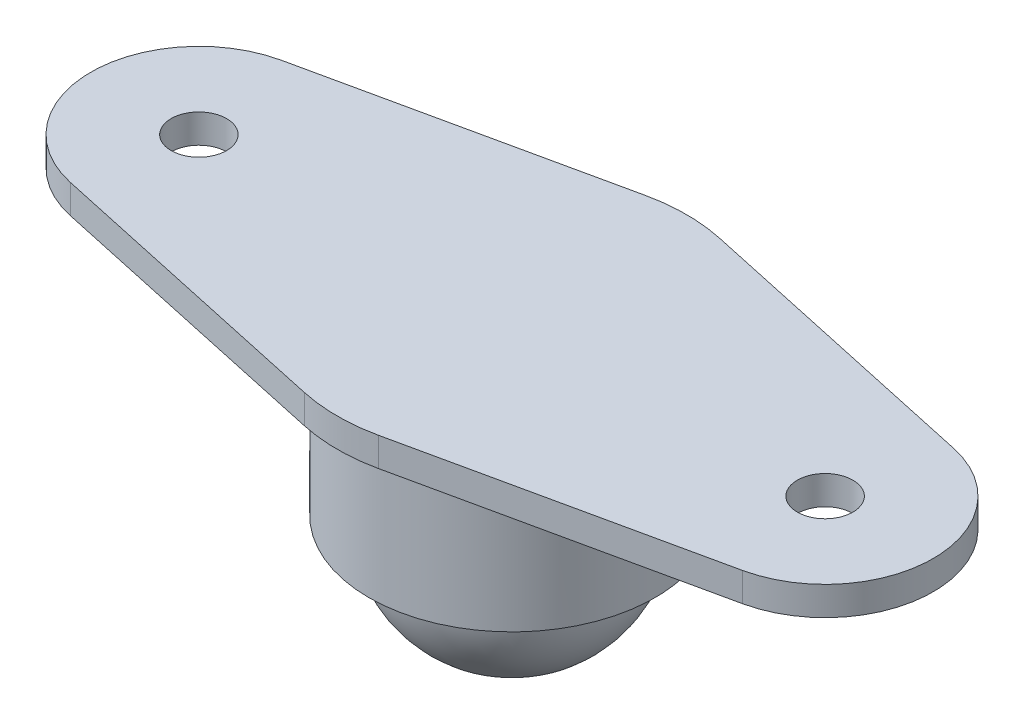
ISO-10303-21;
HEADER;
FILE_DESCRIPTION(('STEP AP214'),'2;1');
FILE_NAME('part.step','',(''),(''),'','','');
FILE_SCHEMA(('AUTOMOTIVE_DESIGN { 1 0 10303 214 1 1 1 1 }'));
ENDSEC;
DATA;
#1=APPLICATION_CONTEXT('core data for automotive mechanical design processes');
#2=APPLICATION_PROTOCOL_DEFINITION('international standard','automotive_design',2000,#1);
#3=PRODUCT_CONTEXT('',#1,'mechanical');
#4=PRODUCT('Part','Part','',(#3));
#5=PRODUCT_RELATED_PRODUCT_CATEGORY('part','',(#4));
#6=PRODUCT_DEFINITION_FORMATION('','',#4);
#7=PRODUCT_DEFINITION_CONTEXT('part definition',#1,'design');
#8=PRODUCT_DEFINITION('design','',#6,#7);
#9=PRODUCT_DEFINITION_SHAPE('','',#8);
#10=(LENGTH_UNIT() NAMED_UNIT(*) SI_UNIT(.MILLI.,.METRE.));
#11=(NAMED_UNIT(*) PLANE_ANGLE_UNIT() SI_UNIT($,.RADIAN.));
#12=(NAMED_UNIT(*) SI_UNIT($,.STERADIAN.) SOLID_ANGLE_UNIT());
#13=UNCERTAINTY_MEASURE_WITH_UNIT(LENGTH_MEASURE(1.E-05),#10,'distance_accuracy_value','');
#14=(GEOMETRIC_REPRESENTATION_CONTEXT(3) GLOBAL_UNCERTAINTY_ASSIGNED_CONTEXT((#13)) GLOBAL_UNIT_ASSIGNED_CONTEXT((#10,
#11,#12)) REPRESENTATION_CONTEXT('',''));
#15=CARTESIAN_POINT('',(0.,0.,0.));
#16=DIRECTION('',(0.,0.,1.));
#17=DIRECTION('',(1.,0.,0.));
#18=AXIS2_PLACEMENT_3D('',#15,#16,#17);
#19=CARTESIAN_POINT('',(0.,-10.075,0.));
#20=DIRECTION('',(0.,1.,0.));
#21=DIRECTION('',(0.,0.,-1.));
#22=AXIS2_PLACEMENT_3D('',#19,#20,#21);
#23=SPHERICAL_SURFACE('',#22,7.925);
#24=CARTESIAN_POINT('',(0.,-2.15,0.));
#25=VERTEX_POINT('',#24);
#26=VERTEX_LOOP('',#25);
#27=FACE_BOUND('',#26,.T.);
#28=ADVANCED_FACE('F43',(#27),#23,.T.);
#29=CLOSED_SHELL('',(#28));
#30=MANIFOLD_SOLID_BREP('B2',#29);
#31=CARTESIAN_POINT('',(-21.72,2.,0.));
#32=DIRECTION('',(0.,1.,0.));
#33=DIRECTION('',(0.,0.,1.));
#34=AXIS2_PLACEMENT_3D('',#31,#32,#33);
#35=PLANE('',#34);
#36=CARTESIAN_POINT('',(-21.72,2.,0.));
#37=DIRECTION('',(0.,1.,0.));
#38=DIRECTION('',(0.,0.,1.));
#39=AXIS2_PLACEMENT_3D('',#36,#37,#38);
#40=CIRCLE('',#39,1.925);
#41=CARTESIAN_POINT('',(-21.72,2.,1.925));
#42=VERTEX_POINT('',#41);
#43=EDGE_CURVE('E158',#42,#42,#40,.T.);
#44=ORIENTED_EDGE('',*,*,#43,.F.);
#45=EDGE_LOOP('',(#44));
#46=FACE_BOUND('',#45,.T.);
#47=CARTESIAN_POINT('',(-21.72,2.,0.));
#48=DIRECTION('',(0.,1.,0.));
#49=DIRECTION('',(0.,0.,1.));
#50=AXIS2_PLACEMENT_3D('',#47,#48,#49);
#51=CIRCLE('',#50,7.5);
#52=CARTESIAN_POINT('',(-23.3118508287293,2.,-7.32912074802114));
#53=VERTEX_POINT('',#52);
#54=CARTESIAN_POINT('',(-23.3118508287293,2.,7.32912074802114));
#55=VERTEX_POINT('',#54);
#56=EDGE_CURVE('E169',#53,#55,#51,.T.);
#57=ORIENTED_EDGE('',*,*,#56,.T.);
#58=DIRECTION('',(0.977216099736151,0.,0.212246777163904));
#59=VECTOR('',#58,1.);
#60=CARTESIAN_POINT('',(-23.3118508287293,2.,7.32912074802114));
#61=LINE('',#60,#59);
#62=CARTESIAN_POINT('',(-2.57030847145488,2.,11.8340869678048));
#63=VERTEX_POINT('',#62);
#64=EDGE_CURVE('E117',#55,#63,#61,.T.);
#65=ORIENTED_EDGE('',*,*,#64,.T.);
#66=CARTESIAN_POINT('',(0.,2.,0.));
#67=DIRECTION('',(0.,1.,0.));
#68=DIRECTION('',(0.,0.,1.));
#69=AXIS2_PLACEMENT_3D('',#66,#67,#68);
#70=CIRCLE('',#69,12.11);
#71=CARTESIAN_POINT('',(2.57030847145488,2.,11.8340869678048));
#72=VERTEX_POINT('',#71);
#73=EDGE_CURVE('E201',#63,#72,#70,.T.);
#74=ORIENTED_EDGE('',*,*,#73,.T.);
#75=DIRECTION('',(0.977216099736151,0.,-0.212246777163904));
#76=VECTOR('',#75,1.);
#77=CARTESIAN_POINT('',(23.3118508287293,2.,7.32912074802114));
#78=LINE('',#77,#76);
#79=CARTESIAN_POINT('',(23.3118508287293,2.,7.32912074802114));
#80=VERTEX_POINT('',#79);
#81=EDGE_CURVE('E200',#72,#80,#78,.T.);
#82=ORIENTED_EDGE('',*,*,#81,.T.);
#83=CARTESIAN_POINT('',(21.72,2.,0.));
#84=DIRECTION('',(0.,1.,0.));
#85=DIRECTION('',(0.,0.,-1.));
#86=AXIS2_PLACEMENT_3D('',#83,#84,#85);
#87=CIRCLE('',#86,7.5);
#88=CARTESIAN_POINT('',(23.3118508287293,2.,-7.32912074802114));
#89=VERTEX_POINT('',#88);
#90=EDGE_CURVE('E136',#80,#89,#87,.T.);
#91=ORIENTED_EDGE('',*,*,#90,.T.);
#92=DIRECTION('',(-0.977216099736151,0.,-0.212246777163904));
#93=VECTOR('',#92,1.);
#94=CARTESIAN_POINT('',(23.3118508287293,2.,-7.32912074802114));
#95=LINE('',#94,#93);
#96=CARTESIAN_POINT('',(2.57030847145488,2.,-11.8340869678048));
#97=VERTEX_POINT('',#96);
#98=EDGE_CURVE('E130',#89,#97,#95,.T.);
#99=ORIENTED_EDGE('',*,*,#98,.T.);
#100=CARTESIAN_POINT('',(0.,2.,0.));
#101=DIRECTION('',(0.,1.,0.));
#102=DIRECTION('',(0.,0.,1.));
#103=AXIS2_PLACEMENT_3D('',#100,#101,#102);
#104=CIRCLE('',#103,12.11);
#105=CARTESIAN_POINT('',(-2.57030847145488,2.,-11.8340869678048));
#106=VERTEX_POINT('',#105);
#107=EDGE_CURVE('E134',#97,#106,#104,.T.);
#108=ORIENTED_EDGE('',*,*,#107,.T.);
#109=DIRECTION('',(-0.977216099736151,0.,0.212246777163904));
#110=VECTOR('',#109,1.);
#111=CARTESIAN_POINT('',(-23.3118508287293,2.,-7.32912074802114));
#112=LINE('',#111,#110);
#113=EDGE_CURVE('E73',#106,#53,#112,.T.);
#114=ORIENTED_EDGE('',*,*,#113,.T.);
#115=EDGE_LOOP('',(#57,#65,#74,#82,#91,#99,#108,#114));
#116=FACE_BOUND('',#115,.T.);
#117=CARTESIAN_POINT('',(21.72,2.,0.));
#118=DIRECTION('',(0.,1.,0.));
#119=DIRECTION('',(0.,0.,-1.));
#120=AXIS2_PLACEMENT_3D('',#117,#118,#119);
#121=CIRCLE('',#120,1.925);
#122=CARTESIAN_POINT('',(21.72,2.,-1.925));
#123=VERTEX_POINT('',#122);
#124=EDGE_CURVE('E210',#123,#123,#121,.T.);
#125=ORIENTED_EDGE('',*,*,#124,.F.);
#126=EDGE_LOOP('',(#125));
#127=FACE_BOUND('',#126,.T.);
#128=ADVANCED_FACE('F56',(#46,#116,#127),#35,.T.);
#129=CARTESIAN_POINT('',(-21.72,0.,0.));
#130=DIRECTION('',(0.,1.,0.));
#131=DIRECTION('',(0.,0.,1.));
#132=AXIS2_PLACEMENT_3D('',#129,#130,#131);
#133=PLANE('',#132);
#134=CARTESIAN_POINT('',(0.,0.,0.));
#135=DIRECTION('',(0.,1.,0.));
#136=DIRECTION('',(0.,0.,1.));
#137=AXIS2_PLACEMENT_3D('',#134,#135,#136);
#138=CIRCLE('',#137,9.925);
#139=CARTESIAN_POINT('',(0.,0.,9.925));
#140=VERTEX_POINT('',#139);
#141=EDGE_CURVE('E41',#140,#140,#138,.F.);
#142=ORIENTED_EDGE('',*,*,#141,.F.);
#143=EDGE_LOOP('',(#142));
#144=FACE_BOUND('',#143,.T.);
#145=CARTESIAN_POINT('',(-21.72,0.,0.));
#146=DIRECTION('',(0.,1.,0.));
#147=DIRECTION('',(0.,0.,1.));
#148=AXIS2_PLACEMENT_3D('',#145,#146,#147);
#149=CIRCLE('',#148,7.5);
#150=CARTESIAN_POINT('',(-23.3118508287293,0.,-7.32912074802114));
#151=VERTEX_POINT('',#150);
#152=CARTESIAN_POINT('',(-23.3118508287293,0.,7.32912074802114));
#153=VERTEX_POINT('',#152);
#154=EDGE_CURVE('E154',#151,#153,#149,.T.);
#155=ORIENTED_EDGE('',*,*,#154,.F.);
#156=DIRECTION('',(-0.977216099736151,0.,0.212246777163904));
#157=VECTOR('',#156,1.);
#158=CARTESIAN_POINT('',(-23.3118508287293,0.,-7.32912074802114));
#159=LINE('',#158,#157);
#160=CARTESIAN_POINT('',(-2.57030847145488,0.,-11.8340869678048));
#161=VERTEX_POINT('',#160);
#162=EDGE_CURVE('E108',#161,#151,#159,.T.);
#163=ORIENTED_EDGE('',*,*,#162,.F.);
#164=CARTESIAN_POINT('',(0.,0.,0.));
#165=DIRECTION('',(0.,1.,0.));
#166=DIRECTION('',(0.,0.,1.));
#167=AXIS2_PLACEMENT_3D('',#164,#165,#166);
#168=CIRCLE('',#167,12.11);
#169=CARTESIAN_POINT('',(2.57030847145488,0.,-11.8340869678048));
#170=VERTEX_POINT('',#169);
#171=EDGE_CURVE('E102',#170,#161,#168,.T.);
#172=ORIENTED_EDGE('',*,*,#171,.F.);
#173=DIRECTION('',(-0.977216099736151,0.,-0.212246777163904));
#174=VECTOR('',#173,1.);
#175=CARTESIAN_POINT('',(23.3118508287293,0.,-7.32912074802114));
#176=LINE('',#175,#174);
#177=CARTESIAN_POINT('',(23.3118508287293,0.,-7.32912074802114));
#178=VERTEX_POINT('',#177);
#179=EDGE_CURVE('E144',#178,#170,#176,.T.);
#180=ORIENTED_EDGE('',*,*,#179,.F.);
#181=CARTESIAN_POINT('',(21.72,0.,0.));
#182=DIRECTION('',(0.,1.,0.));
#183=DIRECTION('',(0.,0.,-1.));
#184=AXIS2_PLACEMENT_3D('',#181,#182,#183);
#185=CIRCLE('',#184,7.5);
#186=CARTESIAN_POINT('',(23.3118508287293,0.,7.32912074802114));
#187=VERTEX_POINT('',#186);
#188=EDGE_CURVE('E164',#187,#178,#185,.T.);
#189=ORIENTED_EDGE('',*,*,#188,.F.);
#190=DIRECTION('',(0.977216099736151,0.,-0.212246777163904));
#191=VECTOR('',#190,1.);
#192=CARTESIAN_POINT('',(23.3118508287293,0.,7.32912074802114));
#193=LINE('',#192,#191);
#194=CARTESIAN_POINT('',(2.57030847145488,0.,11.8340869678048));
#195=VERTEX_POINT('',#194);
#196=EDGE_CURVE('E162',#195,#187,#193,.T.);
#197=ORIENTED_EDGE('',*,*,#196,.F.);
#198=CARTESIAN_POINT('',(0.,0.,0.));
#199=DIRECTION('',(0.,1.,0.));
#200=DIRECTION('',(0.,0.,1.));
#201=AXIS2_PLACEMENT_3D('',#198,#199,#200);
#202=CIRCLE('',#201,12.11);
#203=CARTESIAN_POINT('',(-2.57030847145488,0.,11.8340869678048));
#204=VERTEX_POINT('',#203);
#205=EDGE_CURVE('E160',#204,#195,#202,.T.);
#206=ORIENTED_EDGE('',*,*,#205,.F.);
#207=DIRECTION('',(0.977216099736151,0.,0.212246777163904));
#208=VECTOR('',#207,1.);
#209=CARTESIAN_POINT('',(-23.3118508287293,0.,7.32912074802114));
#210=LINE('',#209,#208);
#211=EDGE_CURVE('E157',#153,#204,#210,.T.);
#212=ORIENTED_EDGE('',*,*,#211,.F.);
#213=EDGE_LOOP('',(#155,#163,#172,#180,#189,#197,#206,#212));
#214=FACE_BOUND('',#213,.T.);
#215=CARTESIAN_POINT('',(-21.72,0.,0.));
#216=DIRECTION('',(0.,1.,0.));
#217=DIRECTION('',(0.,0.,1.));
#218=AXIS2_PLACEMENT_3D('',#215,#216,#217);
#219=CIRCLE('',#218,1.925);
#220=CARTESIAN_POINT('',(-21.72,0.,1.925));
#221=VERTEX_POINT('',#220);
#222=EDGE_CURVE('E207',#221,#221,#219,.T.);
#223=ORIENTED_EDGE('',*,*,#222,.T.);
#224=EDGE_LOOP('',(#223));
#225=FACE_BOUND('',#224,.T.);
#226=CARTESIAN_POINT('',(21.72,0.,0.));
#227=DIRECTION('',(0.,1.,0.));
#228=DIRECTION('',(0.,0.,-1.));
#229=AXIS2_PLACEMENT_3D('',#226,#227,#228);
#230=CIRCLE('',#229,1.925);
#231=CARTESIAN_POINT('',(21.72,0.,-1.925));
#232=VERTEX_POINT('',#231);
#233=EDGE_CURVE('E213',#232,#232,#230,.T.);
#234=ORIENTED_EDGE('',*,*,#233,.T.);
#235=EDGE_LOOP('',(#234));
#236=FACE_BOUND('',#235,.T.);
#237=ADVANCED_FACE('F187',(#144,#214,#225,#236),#133,.F.);
#238=CARTESIAN_POINT('',(-21.72,2.,0.));
#239=DIRECTION('',(0.,-1.,0.));
#240=DIRECTION('',(0.,0.,-1.));
#241=AXIS2_PLACEMENT_3D('',#238,#239,#240);
#242=CYLINDRICAL_SURFACE('',#241,7.5);
#243=ORIENTED_EDGE('',*,*,#154,.T.);
#244=DIRECTION('',(0.,-1.,0.));
#245=VECTOR('',#244,1.);
#246=CARTESIAN_POINT('',(-23.3118508287293,2.,7.32912074802114));
#247=LINE('',#246,#245);
#248=EDGE_CURVE('E65',#55,#153,#247,.T.);
#249=ORIENTED_EDGE('',*,*,#248,.F.);
#250=ORIENTED_EDGE('',*,*,#56,.F.);
#251=DIRECTION('',(0.,-1.,0.));
#252=VECTOR('',#251,1.);
#253=CARTESIAN_POINT('',(-23.3118508287293,2.,-7.32912074802114));
#254=LINE('',#253,#252);
#255=EDGE_CURVE('E150',#53,#151,#254,.T.);
#256=ORIENTED_EDGE('',*,*,#255,.T.);
#257=EDGE_LOOP('',(#243,#249,#250,#256));
#258=FACE_BOUND('',#257,.T.);
#259=ADVANCED_FACE('F58',(#258),#242,.T.);
#260=CARTESIAN_POINT('',(-23.3118508287293,2.,7.32912074802114));
#261=DIRECTION('',(0.212246777163904,0.,-0.977216099736152));
#262=DIRECTION('',(-0.977216099736152,0.,-0.212246777163904));
#263=AXIS2_PLACEMENT_3D('',#260,#261,#262);
#264=PLANE('',#263);
#265=ORIENTED_EDGE('',*,*,#211,.T.);
#266=DIRECTION('',(0.,-1.,0.));
#267=VECTOR('',#266,1.);
#268=CARTESIAN_POINT('',(-2.57030847145488,2.,11.8340869678048));
#269=LINE('',#268,#267);
#270=EDGE_CURVE('E179',#63,#204,#269,.T.);
#271=ORIENTED_EDGE('',*,*,#270,.F.);
#272=ORIENTED_EDGE('',*,*,#64,.F.);
#273=ORIENTED_EDGE('',*,*,#248,.T.);
#274=EDGE_LOOP('',(#265,#271,#272,#273));
#275=FACE_BOUND('',#274,.T.);
#276=ADVANCED_FACE('F182',(#275),#264,.F.);
#277=CARTESIAN_POINT('',(0.,2.,0.));
#278=DIRECTION('',(0.,-1.,0.));
#279=DIRECTION('',(0.,0.,-1.));
#280=AXIS2_PLACEMENT_3D('',#277,#278,#279);
#281=CYLINDRICAL_SURFACE('',#280,12.11);
#282=ORIENTED_EDGE('',*,*,#205,.T.);
#283=DIRECTION('',(0.,-1.,0.));
#284=VECTOR('',#283,1.);
#285=CARTESIAN_POINT('',(2.57030847145488,2.,11.8340869678048));
#286=LINE('',#285,#284);
#287=EDGE_CURVE('E176',#72,#195,#286,.T.);
#288=ORIENTED_EDGE('',*,*,#287,.F.);
#289=ORIENTED_EDGE('',*,*,#73,.F.);
#290=ORIENTED_EDGE('',*,*,#270,.T.);
#291=EDGE_LOOP('',(#282,#288,#289,#290));
#292=FACE_BOUND('',#291,.T.);
#293=ADVANCED_FACE('F194',(#292),#281,.T.);
#294=CARTESIAN_POINT('',(23.3118508287293,2.,7.32912074802114));
#295=DIRECTION('',(-0.212246777163904,0.,-0.977216099736152));
#296=DIRECTION('',(-0.977216099736152,0.,0.212246777163904));
#297=AXIS2_PLACEMENT_3D('',#294,#295,#296);
#298=PLANE('',#297);
#299=ORIENTED_EDGE('',*,*,#196,.T.);
#300=DIRECTION('',(0.,-1.,0.));
#301=VECTOR('',#300,1.);
#302=CARTESIAN_POINT('',(23.3118508287293,2.,7.32912074802114));
#303=LINE('',#302,#301);
#304=EDGE_CURVE('E173',#80,#187,#303,.T.);
#305=ORIENTED_EDGE('',*,*,#304,.F.);
#306=ORIENTED_EDGE('',*,*,#81,.F.);
#307=ORIENTED_EDGE('',*,*,#287,.T.);
#308=EDGE_LOOP('',(#299,#305,#306,#307));
#309=FACE_BOUND('',#308,.T.);
#310=ADVANCED_FACE('F198',(#309),#298,.F.);
#311=CARTESIAN_POINT('',(21.72,2.,0.));
#312=DIRECTION('',(0.,-1.,0.));
#313=DIRECTION('',(0.,0.,-1.));
#314=AXIS2_PLACEMENT_3D('',#311,#312,#313);
#315=CYLINDRICAL_SURFACE('',#314,7.5);
#316=ORIENTED_EDGE('',*,*,#188,.T.);
#317=DIRECTION('',(0.,-1.,0.));
#318=VECTOR('',#317,1.);
#319=CARTESIAN_POINT('',(23.3118508287293,2.,-7.32912074802114));
#320=LINE('',#319,#318);
#321=EDGE_CURVE('E145',#89,#178,#320,.T.);
#322=ORIENTED_EDGE('',*,*,#321,.F.);
#323=ORIENTED_EDGE('',*,*,#90,.F.);
#324=ORIENTED_EDGE('',*,*,#304,.T.);
#325=EDGE_LOOP('',(#316,#322,#323,#324));
#326=FACE_BOUND('',#325,.T.);
#327=ADVANCED_FACE('F266',(#326),#315,.T.);
#328=CARTESIAN_POINT('',(23.3118508287293,2.,-7.32912074802114));
#329=DIRECTION('',(-0.212246777163904,0.,0.977216099736152));
#330=DIRECTION('',(0.977216099736152,0.,0.212246777163904));
#331=AXIS2_PLACEMENT_3D('',#328,#329,#330);
#332=PLANE('',#331);
#333=ORIENTED_EDGE('',*,*,#179,.T.);
#334=DIRECTION('',(0.,-1.,0.));
#335=VECTOR('',#334,1.);
#336=CARTESIAN_POINT('',(2.57030847145488,2.,-11.8340869678048));
#337=LINE('',#336,#335);
#338=EDGE_CURVE('E141',#97,#170,#337,.T.);
#339=ORIENTED_EDGE('',*,*,#338,.F.);
#340=ORIENTED_EDGE('',*,*,#98,.F.);
#341=ORIENTED_EDGE('',*,*,#321,.T.);
#342=EDGE_LOOP('',(#333,#339,#340,#341));
#343=FACE_BOUND('',#342,.T.);
#344=ADVANCED_FACE('F142',(#343),#332,.F.);
#345=CARTESIAN_POINT('',(0.,2.,0.));
#346=DIRECTION('',(0.,-1.,0.));
#347=DIRECTION('',(0.,0.,-1.));
#348=AXIS2_PLACEMENT_3D('',#345,#346,#347);
#349=CYLINDRICAL_SURFACE('',#348,12.11);
#350=ORIENTED_EDGE('',*,*,#171,.T.);
#351=DIRECTION('',(0.,-1.,0.));
#352=VECTOR('',#351,1.);
#353=CARTESIAN_POINT('',(-2.57030847145488,2.,-11.8340869678048));
#354=LINE('',#353,#352);
#355=EDGE_CURVE('E146',#106,#161,#354,.T.);
#356=ORIENTED_EDGE('',*,*,#355,.F.);
#357=ORIENTED_EDGE('',*,*,#107,.F.);
#358=ORIENTED_EDGE('',*,*,#338,.T.);
#359=EDGE_LOOP('',(#350,#356,#357,#358));
#360=FACE_BOUND('',#359,.T.);
#361=ADVANCED_FACE('F148',(#360),#349,.T.);
#362=CARTESIAN_POINT('',(-23.3118508287293,2.,-7.32912074802114));
#363=DIRECTION('',(0.212246777163904,0.,0.977216099736152));
#364=DIRECTION('',(0.977216099736152,0.,-0.212246777163904));
#365=AXIS2_PLACEMENT_3D('',#362,#363,#364);
#366=PLANE('',#365);
#367=ORIENTED_EDGE('',*,*,#162,.T.);
#368=ORIENTED_EDGE('',*,*,#255,.F.);
#369=ORIENTED_EDGE('',*,*,#113,.F.);
#370=ORIENTED_EDGE('',*,*,#355,.T.);
#371=EDGE_LOOP('',(#367,#368,#369,#370));
#372=FACE_BOUND('',#371,.T.);
#373=ADVANCED_FACE('F259',(#372),#366,.F.);
#374=CARTESIAN_POINT('',(-21.72,2.,0.));
#375=DIRECTION('',(0.,-1.,0.));
#376=DIRECTION('',(0.,0.,-1.));
#377=AXIS2_PLACEMENT_3D('',#374,#375,#376);
#378=CYLINDRICAL_SURFACE('',#377,1.925);
#379=ORIENTED_EDGE('',*,*,#43,.T.);
#380=EDGE_LOOP('',(#379));
#381=FACE_BOUND('',#380,.T.);
#382=ORIENTED_EDGE('',*,*,#222,.F.);
#383=EDGE_LOOP('',(#382));
#384=FACE_BOUND('',#383,.T.);
#385=ADVANCED_FACE('F243',(#381,#384),#378,.F.);
#386=CARTESIAN_POINT('',(21.72,2.,0.));
#387=DIRECTION('',(0.,-1.,0.));
#388=DIRECTION('',(0.,0.,-1.));
#389=AXIS2_PLACEMENT_3D('',#386,#387,#388);
#390=CYLINDRICAL_SURFACE('',#389,1.925);
#391=ORIENTED_EDGE('',*,*,#124,.T.);
#392=EDGE_LOOP('',(#391));
#393=FACE_BOUND('',#392,.T.);
#394=ORIENTED_EDGE('',*,*,#233,.F.);
#395=EDGE_LOOP('',(#394));
#396=FACE_BOUND('',#395,.T.);
#397=ADVANCED_FACE('F234',(#393,#396),#390,.F.);
#398=CARTESIAN_POINT('',(0.,-10.,0.));
#399=DIRECTION('',(0.,-1.,0.));
#400=DIRECTION('',(0.,0.,-1.));
#401=AXIS2_PLACEMENT_3D('',#398,#399,#400);
#402=PLANE('',#401);
#403=CARTESIAN_POINT('',(0.,-10.,0.));
#404=DIRECTION('',(0.,-1.,0.));
#405=DIRECTION('',(0.,0.,-1.));
#406=AXIS2_PLACEMENT_3D('',#403,#404,#405);
#407=CIRCLE('',#406,9.925);
#408=CARTESIAN_POINT('',(0.,-10.,-9.925));
#409=VERTEX_POINT('',#408);
#410=EDGE_CURVE('E216',#409,#409,#407,.T.);
#411=ORIENTED_EDGE('',*,*,#410,.T.);
#412=EDGE_LOOP('',(#411));
#413=FACE_BOUND('',#412,.T.);
#414=CARTESIAN_POINT('',(0.,-10.,0.));
#415=DIRECTION('',(0.,-1.,0.));
#416=DIRECTION('',(0.,0.,-1.));
#417=AXIS2_PLACEMENT_3D('',#414,#415,#416);
#418=CIRCLE('',#417,7.925);
#419=CARTESIAN_POINT('',(0.,-10.,-7.925));
#420=VERTEX_POINT('',#419);
#421=EDGE_CURVE('E221',#420,#420,#418,.T.);
#422=ORIENTED_EDGE('',*,*,#421,.F.);
#423=EDGE_LOOP('',(#422));
#424=FACE_BOUND('',#423,.T.);
#425=ADVANCED_FACE('F231',(#413,#424),#402,.T.);
#426=CARTESIAN_POINT('',(0.,-10.,0.));
#427=DIRECTION('',(0.,1.,0.));
#428=DIRECTION('',(0.,0.,1.));
#429=AXIS2_PLACEMENT_3D('',#426,#427,#428);
#430=CYLINDRICAL_SURFACE('',#429,9.925);
#431=ORIENTED_EDGE('',*,*,#410,.F.);
#432=EDGE_LOOP('',(#431));
#433=FACE_BOUND('',#432,.T.);
#434=ORIENTED_EDGE('',*,*,#141,.T.);
#435=EDGE_LOOP('',(#434));
#436=FACE_BOUND('',#435,.T.);
#437=ADVANCED_FACE('F233',(#433,#436),#430,.T.);
#438=CARTESIAN_POINT('',(0.,-10.,0.));
#439=DIRECTION('',(0.,1.,0.));
#440=DIRECTION('',(0.,0.,1.));
#441=AXIS2_PLACEMENT_3D('',#438,#439,#440);
#442=CYLINDRICAL_SURFACE('',#441,7.925);
#443=ORIENTED_EDGE('',*,*,#421,.T.);
#444=EDGE_LOOP('',(#443));
#445=FACE_BOUND('',#444,.T.);
#446=CARTESIAN_POINT('',(0.,0.,0.));
#447=DIRECTION('',(0.,-1.,0.));
#448=DIRECTION('',(0.,0.,-1.));
#449=AXIS2_PLACEMENT_3D('',#446,#447,#448);
#450=CIRCLE('',#449,7.925);
#451=CARTESIAN_POINT('',(0.,0.,-7.925));
#452=VERTEX_POINT('',#451);
#453=EDGE_CURVE('E222',#452,#452,#450,.T.);
#454=ORIENTED_EDGE('',*,*,#453,.F.);
#455=EDGE_LOOP('',(#454));
#456=FACE_BOUND('',#455,.T.);
#457=ADVANCED_FACE('F228',(#445,#456),#442,.F.);
#458=ORIENTED_EDGE('',*,*,#453,.T.);
#459=EDGE_LOOP('',(#458));
#460=FACE_BOUND('',#459,.T.);
#461=ADVANCED_FACE('F255',(#460),#133,.F.);
#462=CLOSED_SHELL('',(#128,#237,#259,#276,#293,#310,#327,#344,#361,#373,#385,#397,#425,#437,
#457,#461));
#463=MANIFOLD_SOLID_BREP('B6',#462);
#464=ADVANCED_BREP_SHAPE_REPRESENTATION('',(#18,#30,#463),#14);
#465=SHAPE_DEFINITION_REPRESENTATION(#9,#464);
ENDSEC;
END-ISO-10303-21;
